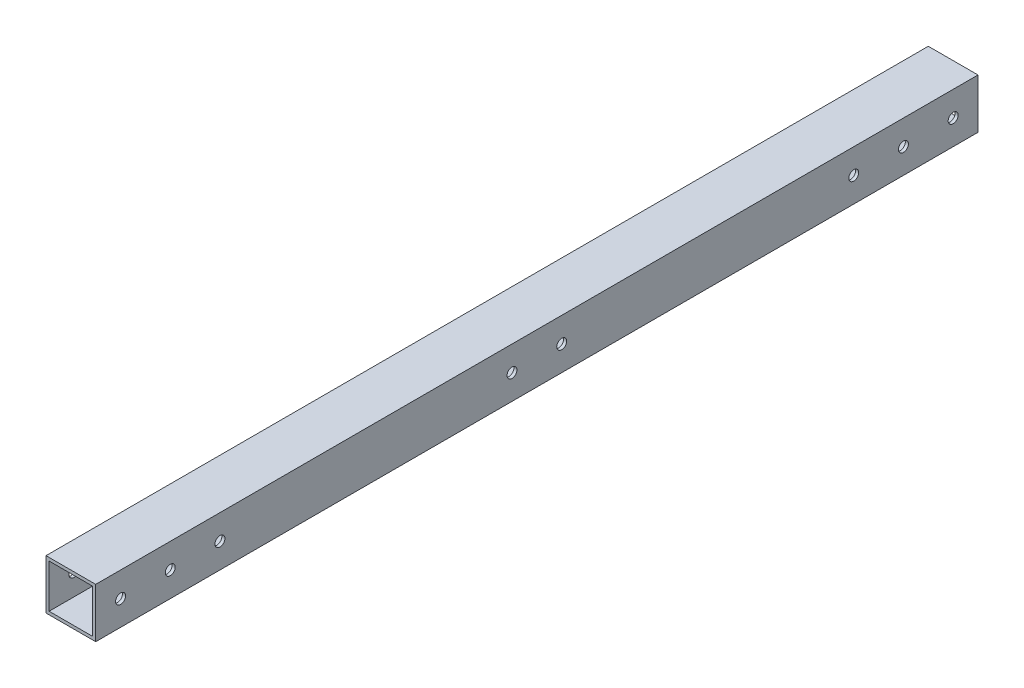
ISO-10303-21;
HEADER;
FILE_DESCRIPTION(('STEP AP214'),'2;1');
FILE_NAME('part.step','',(''),(''),'','','');
FILE_SCHEMA(('AUTOMOTIVE_DESIGN { 1 0 10303 214 1 1 1 1 }'));
ENDSEC;
DATA;
#1=APPLICATION_CONTEXT('core data for automotive mechanical design processes');
#2=APPLICATION_PROTOCOL_DEFINITION('international standard','automotive_design',2000,#1);
#3=PRODUCT_CONTEXT('',#1,'mechanical');
#4=PRODUCT('Part','Part','',(#3));
#5=PRODUCT_RELATED_PRODUCT_CATEGORY('part','',(#4));
#6=PRODUCT_DEFINITION_FORMATION('','',#4);
#7=PRODUCT_DEFINITION_CONTEXT('part definition',#1,'design');
#8=PRODUCT_DEFINITION('design','',#6,#7);
#9=PRODUCT_DEFINITION_SHAPE('','',#8);
#10=(LENGTH_UNIT() NAMED_UNIT(*) SI_UNIT(.MILLI.,.METRE.));
#11=(NAMED_UNIT(*) PLANE_ANGLE_UNIT() SI_UNIT($,.RADIAN.));
#12=(NAMED_UNIT(*) SI_UNIT($,.STERADIAN.) SOLID_ANGLE_UNIT());
#13=UNCERTAINTY_MEASURE_WITH_UNIT(LENGTH_MEASURE(1.E-05),#10,'distance_accuracy_value','');
#14=(GEOMETRIC_REPRESENTATION_CONTEXT(3) GLOBAL_UNCERTAINTY_ASSIGNED_CONTEXT((#13)) GLOBAL_UNIT_ASSIGNED_CONTEXT((#10,
#11,#12)) REPRESENTATION_CONTEXT('',''));
#15=CARTESIAN_POINT('',(0.,0.,0.));
#16=DIRECTION('',(0.,0.,1.));
#17=DIRECTION('',(1.,0.,0.));
#18=AXIS2_PLACEMENT_3D('',#15,#16,#17);
#19=CARTESIAN_POINT('',(0.,0.,450.85));
#20=DIRECTION('',(0.,0.,-1.));
#21=DIRECTION('',(-1.,0.,0.));
#22=AXIS2_PLACEMENT_3D('',#19,#20,#21);
#23=PLANE('',#22);
#24=DIRECTION('',(0.,-1.,0.));
#25=VECTOR('',#24,1.);
#26=CARTESIAN_POINT('',(0.,0.,450.85));
#27=LINE('',#26,#25);
#28=CARTESIAN_POINT('',(0.,25.4,450.85));
#29=VERTEX_POINT('',#28);
#30=CARTESIAN_POINT('',(0.,0.,450.85));
#31=VERTEX_POINT('',#30);
#32=EDGE_CURVE('E157',#29,#31,#27,.T.);
#33=ORIENTED_EDGE('',*,*,#32,.T.);
#34=DIRECTION('',(1.,0.,0.));
#35=VECTOR('',#34,1.);
#36=CARTESIAN_POINT('',(0.,0.,450.85));
#37=LINE('',#36,#35);
#38=CARTESIAN_POINT('',(25.4,0.,450.85));
#39=VERTEX_POINT('',#38);
#40=EDGE_CURVE('E161',#31,#39,#37,.T.);
#41=ORIENTED_EDGE('',*,*,#40,.T.);
#42=DIRECTION('',(0.,1.,0.));
#43=VECTOR('',#42,1.);
#44=CARTESIAN_POINT('',(25.4,0.,450.85));
#45=LINE('',#44,#43);
#46=CARTESIAN_POINT('',(25.4,25.4,450.85));
#47=VERTEX_POINT('',#46);
#48=EDGE_CURVE('E165',#39,#47,#45,.T.);
#49=ORIENTED_EDGE('',*,*,#48,.T.);
#50=DIRECTION('',(-1.,0.,0.));
#51=VECTOR('',#50,1.);
#52=CARTESIAN_POINT('',(0.,25.4,450.85));
#53=LINE('',#52,#51);
#54=EDGE_CURVE('E168',#47,#29,#53,.T.);
#55=ORIENTED_EDGE('',*,*,#54,.T.);
#56=EDGE_LOOP('',(#33,#41,#49,#55));
#57=FACE_BOUND('',#56,.T.);
#58=DIRECTION('',(0.,-1.,0.));
#59=VECTOR('',#58,1.);
#60=CARTESIAN_POINT('',(1.5875,1.5875,450.85));
#61=LINE('',#60,#59);
#62=CARTESIAN_POINT('',(1.5875,23.8125,450.85));
#63=VERTEX_POINT('',#62);
#64=CARTESIAN_POINT('',(1.5875,1.5875,450.85));
#65=VERTEX_POINT('',#64);
#66=EDGE_CURVE('E107',#63,#65,#61,.T.);
#67=ORIENTED_EDGE('',*,*,#66,.F.);
#68=DIRECTION('',(-1.,0.,0.));
#69=VECTOR('',#68,1.);
#70=CARTESIAN_POINT('',(1.5875,23.8125,450.85));
#71=LINE('',#70,#69);
#72=CARTESIAN_POINT('',(23.8125,23.8125,450.85));
#73=VERTEX_POINT('',#72);
#74=EDGE_CURVE('E133',#73,#63,#71,.T.);
#75=ORIENTED_EDGE('',*,*,#74,.F.);
#76=DIRECTION('',(0.,1.,0.));
#77=VECTOR('',#76,1.);
#78=CARTESIAN_POINT('',(23.8125,1.5875,450.85));
#79=LINE('',#78,#77);
#80=CARTESIAN_POINT('',(23.8125,1.5875,450.85));
#81=VERTEX_POINT('',#80);
#82=EDGE_CURVE('E129',#81,#73,#79,.T.);
#83=ORIENTED_EDGE('',*,*,#82,.F.);
#84=DIRECTION('',(1.,0.,0.));
#85=VECTOR('',#84,1.);
#86=CARTESIAN_POINT('',(1.5875,1.5875,450.85));
#87=LINE('',#86,#85);
#88=EDGE_CURVE('E116',#65,#81,#87,.T.);
#89=ORIENTED_EDGE('',*,*,#88,.F.);
#90=EDGE_LOOP('',(#67,#75,#83,#89));
#91=FACE_BOUND('',#90,.T.);
#92=ADVANCED_FACE('F39',(#57,#91),#23,.F.);
#93=CARTESIAN_POINT('',(0.,0.,0.));
#94=DIRECTION('',(0.,0.,-1.));
#95=DIRECTION('',(-1.,0.,0.));
#96=AXIS2_PLACEMENT_3D('',#93,#94,#95);
#97=PLANE('',#96);
#98=DIRECTION('',(0.,-1.,0.));
#99=VECTOR('',#98,1.);
#100=CARTESIAN_POINT('',(0.,0.,0.));
#101=LINE('',#100,#99);
#102=CARTESIAN_POINT('',(0.,25.4,0.));
#103=VERTEX_POINT('',#102);
#104=CARTESIAN_POINT('',(0.,0.,0.));
#105=VERTEX_POINT('',#104);
#106=EDGE_CURVE('E125',#103,#105,#101,.T.);
#107=ORIENTED_EDGE('',*,*,#106,.F.);
#108=DIRECTION('',(-1.,0.,0.));
#109=VECTOR('',#108,1.);
#110=CARTESIAN_POINT('',(0.,25.4,0.));
#111=LINE('',#110,#109);
#112=CARTESIAN_POINT('',(25.4,25.4,0.));
#113=VERTEX_POINT('',#112);
#114=EDGE_CURVE('E162',#113,#103,#111,.T.);
#115=ORIENTED_EDGE('',*,*,#114,.F.);
#116=DIRECTION('',(0.,1.,0.));
#117=VECTOR('',#116,1.);
#118=CARTESIAN_POINT('',(25.4,0.,0.));
#119=LINE('',#118,#117);
#120=CARTESIAN_POINT('',(25.4,0.,0.));
#121=VERTEX_POINT('',#120);
#122=EDGE_CURVE('E178',#121,#113,#119,.T.);
#123=ORIENTED_EDGE('',*,*,#122,.F.);
#124=DIRECTION('',(1.,0.,0.));
#125=VECTOR('',#124,1.);
#126=CARTESIAN_POINT('',(0.,0.,0.));
#127=LINE('',#126,#125);
#128=EDGE_CURVE('E175',#105,#121,#127,.T.);
#129=ORIENTED_EDGE('',*,*,#128,.F.);
#130=EDGE_LOOP('',(#107,#115,#123,#129));
#131=FACE_BOUND('',#130,.T.);
#132=DIRECTION('',(-1.,0.,0.));
#133=VECTOR('',#132,1.);
#134=CARTESIAN_POINT('',(1.5875,23.8125,0.));
#135=LINE('',#134,#133);
#136=CARTESIAN_POINT('',(23.8125,23.8125,0.));
#137=VERTEX_POINT('',#136);
#138=CARTESIAN_POINT('',(1.5875,23.8125,0.));
#139=VERTEX_POINT('',#138);
#140=EDGE_CURVE('E117',#137,#139,#135,.T.);
#141=ORIENTED_EDGE('',*,*,#140,.T.);
#142=DIRECTION('',(0.,-1.,0.));
#143=VECTOR('',#142,1.);
#144=CARTESIAN_POINT('',(1.5875,1.5875,0.));
#145=LINE('',#144,#143);
#146=CARTESIAN_POINT('',(1.5875,1.5875,0.));
#147=VERTEX_POINT('',#146);
#148=EDGE_CURVE('E65',#139,#147,#145,.T.);
#149=ORIENTED_EDGE('',*,*,#148,.T.);
#150=DIRECTION('',(1.,0.,0.));
#151=VECTOR('',#150,1.);
#152=CARTESIAN_POINT('',(1.5875,1.5875,0.));
#153=LINE('',#152,#151);
#154=CARTESIAN_POINT('',(23.8125,1.5875,0.));
#155=VERTEX_POINT('',#154);
#156=EDGE_CURVE('E123',#147,#155,#153,.T.);
#157=ORIENTED_EDGE('',*,*,#156,.T.);
#158=DIRECTION('',(0.,1.,0.));
#159=VECTOR('',#158,1.);
#160=CARTESIAN_POINT('',(23.8125,1.5875,0.));
#161=LINE('',#160,#159);
#162=EDGE_CURVE('E144',#155,#137,#161,.T.);
#163=ORIENTED_EDGE('',*,*,#162,.T.);
#164=EDGE_LOOP('',(#141,#149,#157,#163));
#165=FACE_BOUND('',#164,.T.);
#166=ADVANCED_FACE('F270',(#131,#165),#97,.T.);
#167=CARTESIAN_POINT('',(0.,0.,450.85));
#168=DIRECTION('',(1.,0.,0.));
#169=DIRECTION('',(0.,0.,-1.));
#170=AXIS2_PLACEMENT_3D('',#167,#168,#169);
#171=PLANE('',#170);
#172=CARTESIAN_POINT('',(0.,12.7,438.15));
#173=DIRECTION('',(1.,0.,0.));
#174=DIRECTION('',(0.,0.,-1.));
#175=AXIS2_PLACEMENT_3D('',#172,#173,#174);
#176=CIRCLE('',#175,2.54000000000001);
#177=CARTESIAN_POINT('',(0.,12.7,435.61));
#178=VERTEX_POINT('',#177);
#179=EDGE_CURVE('E198',#178,#178,#176,.T.);
#180=ORIENTED_EDGE('',*,*,#179,.T.);
#181=EDGE_LOOP('',(#180));
#182=FACE_BOUND('',#181,.T.);
#183=CARTESIAN_POINT('',(0.,12.7,12.7));
#184=DIRECTION('',(1.,0.,0.));
#185=DIRECTION('',(0.,0.,1.));
#186=AXIS2_PLACEMENT_3D('',#183,#184,#185);
#187=CIRCLE('',#186,2.54000000000001);
#188=CARTESIAN_POINT('',(0.,12.7,15.24));
#189=VERTEX_POINT('',#188);
#190=EDGE_CURVE('E327',#189,#189,#187,.T.);
#191=ORIENTED_EDGE('',*,*,#190,.T.);
#192=EDGE_LOOP('',(#191));
#193=FACE_BOUND('',#192,.T.);
#194=CARTESIAN_POINT('',(0.,12.7,238.125));
#195=DIRECTION('',(1.,0.,0.));
#196=DIRECTION('',(0.,0.,-1.));
#197=AXIS2_PLACEMENT_3D('',#194,#195,#196);
#198=CIRCLE('',#197,2.53999999999998);
#199=CARTESIAN_POINT('',(0.,12.7,235.585));
#200=VERTEX_POINT('',#199);
#201=EDGE_CURVE('E331',#200,#200,#198,.T.);
#202=ORIENTED_EDGE('',*,*,#201,.T.);
#203=EDGE_LOOP('',(#202));
#204=FACE_BOUND('',#203,.T.);
#205=CARTESIAN_POINT('',(0.,12.7,212.725));
#206=DIRECTION('',(1.,0.,0.));
#207=DIRECTION('',(0.,0.,1.));
#208=AXIS2_PLACEMENT_3D('',#205,#206,#207);
#209=CIRCLE('',#208,2.53999999999998);
#210=CARTESIAN_POINT('',(0.,12.7,215.265));
#211=VERTEX_POINT('',#210);
#212=EDGE_CURVE('E335',#211,#211,#209,.T.);
#213=ORIENTED_EDGE('',*,*,#212,.T.);
#214=EDGE_LOOP('',(#213));
#215=FACE_BOUND('',#214,.T.);
#216=CARTESIAN_POINT('',(0.,12.7,38.1));
#217=DIRECTION('',(1.,0.,0.));
#218=DIRECTION('',(0.,0.,1.));
#219=AXIS2_PLACEMENT_3D('',#216,#217,#218);
#220=CIRCLE('',#219,2.54000000000001);
#221=CARTESIAN_POINT('',(0.,12.7,40.64));
#222=VERTEX_POINT('',#221);
#223=EDGE_CURVE('E339',#222,#222,#220,.T.);
#224=ORIENTED_EDGE('',*,*,#223,.T.);
#225=EDGE_LOOP('',(#224));
#226=FACE_BOUND('',#225,.T.);
#227=CARTESIAN_POINT('',(0.,12.7,63.5));
#228=DIRECTION('',(1.,0.,0.));
#229=DIRECTION('',(0.,0.,1.));
#230=AXIS2_PLACEMENT_3D('',#227,#228,#229);
#231=CIRCLE('',#230,2.54000000000001);
#232=CARTESIAN_POINT('',(0.,12.7,66.04));
#233=VERTEX_POINT('',#232);
#234=EDGE_CURVE('E343',#233,#233,#231,.T.);
#235=ORIENTED_EDGE('',*,*,#234,.T.);
#236=EDGE_LOOP('',(#235));
#237=FACE_BOUND('',#236,.T.);
#238=CARTESIAN_POINT('',(0.,12.7,387.35));
#239=DIRECTION('',(1.,0.,0.));
#240=DIRECTION('',(0.,0.,-1.));
#241=AXIS2_PLACEMENT_3D('',#238,#239,#240);
#242=CIRCLE('',#241,2.54000000000001);
#243=CARTESIAN_POINT('',(0.,12.7,384.81));
#244=VERTEX_POINT('',#243);
#245=EDGE_CURVE('E347',#244,#244,#242,.T.);
#246=ORIENTED_EDGE('',*,*,#245,.T.);
#247=EDGE_LOOP('',(#246));
#248=FACE_BOUND('',#247,.T.);
#249=CARTESIAN_POINT('',(0.,12.7,412.75));
#250=DIRECTION('',(1.,0.,0.));
#251=DIRECTION('',(0.,0.,-1.));
#252=AXIS2_PLACEMENT_3D('',#249,#250,#251);
#253=CIRCLE('',#252,2.54000000000001);
#254=CARTESIAN_POINT('',(0.,12.7,410.21));
#255=VERTEX_POINT('',#254);
#256=EDGE_CURVE('E350',#255,#255,#253,.T.);
#257=ORIENTED_EDGE('',*,*,#256,.T.);
#258=EDGE_LOOP('',(#257));
#259=FACE_BOUND('',#258,.T.);
#260=ORIENTED_EDGE('',*,*,#106,.T.);
#261=DIRECTION('',(0.,0.,-1.));
#262=VECTOR('',#261,1.);
#263=CARTESIAN_POINT('',(0.,0.,450.85));
#264=LINE('',#263,#262);
#265=EDGE_CURVE('E11',#31,#105,#264,.T.);
#266=ORIENTED_EDGE('',*,*,#265,.F.);
#267=ORIENTED_EDGE('',*,*,#32,.F.);
#268=DIRECTION('',(0.,0.,-1.));
#269=VECTOR('',#268,1.);
#270=CARTESIAN_POINT('',(0.,25.4,450.85));
#271=LINE('',#270,#269);
#272=EDGE_CURVE('E171',#29,#103,#271,.T.);
#273=ORIENTED_EDGE('',*,*,#272,.T.);
#274=EDGE_LOOP('',(#260,#266,#267,#273));
#275=FACE_BOUND('',#274,.T.);
#276=ADVANCED_FACE('F41',(#182,#193,#204,#215,#226,#237,#248,#259,#275),#171,.F.);
#277=CARTESIAN_POINT('',(0.,0.,450.85));
#278=DIRECTION('',(0.,1.,0.));
#279=DIRECTION('',(0.,0.,1.));
#280=AXIS2_PLACEMENT_3D('',#277,#278,#279);
#281=PLANE('',#280);
#282=ORIENTED_EDGE('',*,*,#128,.T.);
#283=DIRECTION('',(0.,0.,-1.));
#284=VECTOR('',#283,1.);
#285=CARTESIAN_POINT('',(25.4,0.,450.85));
#286=LINE('',#285,#284);
#287=EDGE_CURVE('E49',#39,#121,#286,.T.);
#288=ORIENTED_EDGE('',*,*,#287,.F.);
#289=ORIENTED_EDGE('',*,*,#40,.F.);
#290=ORIENTED_EDGE('',*,*,#265,.T.);
#291=EDGE_LOOP('',(#282,#288,#289,#290));
#292=FACE_BOUND('',#291,.T.);
#293=ADVANCED_FACE('F299',(#292),#281,.F.);
#294=CARTESIAN_POINT('',(25.4,0.,450.85));
#295=DIRECTION('',(-1.,0.,0.));
#296=DIRECTION('',(0.,0.,1.));
#297=AXIS2_PLACEMENT_3D('',#294,#295,#296);
#298=PLANE('',#297);
#299=CARTESIAN_POINT('',(25.4,12.7,438.15));
#300=DIRECTION('',(1.,0.,0.));
#301=DIRECTION('',(0.,0.,-1.));
#302=AXIS2_PLACEMENT_3D('',#299,#300,#301);
#303=CIRCLE('',#302,2.54000000000001);
#304=CARTESIAN_POINT('',(25.4,12.7,435.61));
#305=VERTEX_POINT('',#304);
#306=EDGE_CURVE('E353',#305,#305,#303,.T.);
#307=ORIENTED_EDGE('',*,*,#306,.F.);
#308=EDGE_LOOP('',(#307));
#309=FACE_BOUND('',#308,.T.);
#310=CARTESIAN_POINT('',(25.4,12.7,12.7));
#311=DIRECTION('',(1.,0.,0.));
#312=DIRECTION('',(0.,0.,1.));
#313=AXIS2_PLACEMENT_3D('',#310,#311,#312);
#314=CIRCLE('',#313,2.54000000000001);
#315=CARTESIAN_POINT('',(25.4,12.7,15.24));
#316=VERTEX_POINT('',#315);
#317=EDGE_CURVE('E574',#316,#316,#314,.T.);
#318=ORIENTED_EDGE('',*,*,#317,.F.);
#319=EDGE_LOOP('',(#318));
#320=FACE_BOUND('',#319,.T.);
#321=CARTESIAN_POINT('',(25.4,12.7,238.125));
#322=DIRECTION('',(1.,0.,0.));
#323=DIRECTION('',(0.,0.,-1.));
#324=AXIS2_PLACEMENT_3D('',#321,#322,#323);
#325=CIRCLE('',#324,2.53999999999998);
#326=CARTESIAN_POINT('',(25.4,12.7,235.585));
#327=VERTEX_POINT('',#326);
#328=EDGE_CURVE('E363',#327,#327,#325,.T.);
#329=ORIENTED_EDGE('',*,*,#328,.F.);
#330=EDGE_LOOP('',(#329));
#331=FACE_BOUND('',#330,.T.);
#332=CARTESIAN_POINT('',(25.4,12.7,212.725));
#333=DIRECTION('',(1.,0.,0.));
#334=DIRECTION('',(0.,0.,1.));
#335=AXIS2_PLACEMENT_3D('',#332,#333,#334);
#336=CIRCLE('',#335,2.53999999999998);
#337=CARTESIAN_POINT('',(25.4,12.7,215.265));
#338=VERTEX_POINT('',#337);
#339=EDGE_CURVE('E583',#338,#338,#336,.T.);
#340=ORIENTED_EDGE('',*,*,#339,.F.);
#341=EDGE_LOOP('',(#340));
#342=FACE_BOUND('',#341,.T.);
#343=CARTESIAN_POINT('',(25.4,12.7,38.1));
#344=DIRECTION('',(1.,0.,0.));
#345=DIRECTION('',(0.,0.,1.));
#346=AXIS2_PLACEMENT_3D('',#343,#344,#345);
#347=CIRCLE('',#346,2.54000000000001);
#348=CARTESIAN_POINT('',(25.4,12.7,40.64));
#349=VERTEX_POINT('',#348);
#350=EDGE_CURVE('E380',#349,#349,#347,.T.);
#351=ORIENTED_EDGE('',*,*,#350,.F.);
#352=EDGE_LOOP('',(#351));
#353=FACE_BOUND('',#352,.T.);
#354=CARTESIAN_POINT('',(25.4,12.7,63.5));
#355=DIRECTION('',(1.,0.,0.));
#356=DIRECTION('',(0.,0.,1.));
#357=AXIS2_PLACEMENT_3D('',#354,#355,#356);
#358=CIRCLE('',#357,2.54000000000001);
#359=CARTESIAN_POINT('',(25.4,12.7,66.04));
#360=VERTEX_POINT('',#359);
#361=EDGE_CURVE('E374',#360,#360,#358,.T.);
#362=ORIENTED_EDGE('',*,*,#361,.F.);
#363=EDGE_LOOP('',(#362));
#364=FACE_BOUND('',#363,.T.);
#365=CARTESIAN_POINT('',(25.4,12.7,387.35));
#366=DIRECTION('',(1.,0.,0.));
#367=DIRECTION('',(0.,0.,-1.));
#368=AXIS2_PLACEMENT_3D('',#365,#366,#367);
#369=CIRCLE('',#368,2.54000000000001);
#370=CARTESIAN_POINT('',(25.4,12.7,384.81));
#371=VERTEX_POINT('',#370);
#372=EDGE_CURVE('E368',#371,#371,#369,.T.);
#373=ORIENTED_EDGE('',*,*,#372,.F.);
#374=EDGE_LOOP('',(#373));
#375=FACE_BOUND('',#374,.T.);
#376=CARTESIAN_POINT('',(25.4,12.7,412.75));
#377=DIRECTION('',(1.,0.,0.));
#378=DIRECTION('',(0.,0.,-1.));
#379=AXIS2_PLACEMENT_3D('',#376,#377,#378);
#380=CIRCLE('',#379,2.54000000000001);
#381=CARTESIAN_POINT('',(25.4,12.7,410.21));
#382=VERTEX_POINT('',#381);
#383=EDGE_CURVE('E354',#382,#382,#380,.T.);
#384=ORIENTED_EDGE('',*,*,#383,.F.);
#385=EDGE_LOOP('',(#384));
#386=FACE_BOUND('',#385,.T.);
#387=ORIENTED_EDGE('',*,*,#122,.T.);
#388=DIRECTION('',(0.,0.,-1.));
#389=VECTOR('',#388,1.);
#390=CARTESIAN_POINT('',(25.4,25.4,450.85));
#391=LINE('',#390,#389);
#392=EDGE_CURVE('E186',#47,#113,#391,.T.);
#393=ORIENTED_EDGE('',*,*,#392,.F.);
#394=ORIENTED_EDGE('',*,*,#48,.F.);
#395=ORIENTED_EDGE('',*,*,#287,.T.);
#396=EDGE_LOOP('',(#387,#393,#394,#395));
#397=FACE_BOUND('',#396,.T.);
#398=ADVANCED_FACE('F296',(#309,#320,#331,#342,#353,#364,#375,#386,#397),#298,.F.);
#399=CARTESIAN_POINT('',(0.,25.4,450.85));
#400=DIRECTION('',(0.,-1.,0.));
#401=DIRECTION('',(0.,0.,-1.));
#402=AXIS2_PLACEMENT_3D('',#399,#400,#401);
#403=PLANE('',#402);
#404=ORIENTED_EDGE('',*,*,#114,.T.);
#405=ORIENTED_EDGE('',*,*,#272,.F.);
#406=ORIENTED_EDGE('',*,*,#54,.F.);
#407=ORIENTED_EDGE('',*,*,#392,.T.);
#408=EDGE_LOOP('',(#404,#405,#406,#407));
#409=FACE_BOUND('',#408,.T.);
#410=ADVANCED_FACE('F293',(#409),#403,.F.);
#411=CARTESIAN_POINT('',(1.5875,1.5875,450.85));
#412=DIRECTION('',(1.,0.,0.));
#413=DIRECTION('',(0.,0.,-1.));
#414=AXIS2_PLACEMENT_3D('',#411,#412,#413);
#415=PLANE('',#414);
#416=CARTESIAN_POINT('',(1.5875,12.7,438.15));
#417=DIRECTION('',(1.,0.,0.));
#418=DIRECTION('',(0.,0.,-1.));
#419=AXIS2_PLACEMENT_3D('',#416,#417,#418);
#420=CIRCLE('',#419,2.54000000000001);
#421=CARTESIAN_POINT('',(1.5875,12.7,435.61));
#422=VERTEX_POINT('',#421);
#423=EDGE_CURVE('E141',#422,#422,#420,.T.);
#424=ORIENTED_EDGE('',*,*,#423,.F.);
#425=EDGE_LOOP('',(#424));
#426=FACE_BOUND('',#425,.T.);
#427=CARTESIAN_POINT('',(1.5875,12.7,12.7));
#428=DIRECTION('',(1.,0.,0.));
#429=DIRECTION('',(0.,0.,-1.));
#430=AXIS2_PLACEMENT_3D('',#427,#428,#429);
#431=CIRCLE('',#430,2.54000000000001);
#432=CARTESIAN_POINT('',(1.5875,12.7,10.16));
#433=VERTEX_POINT('',#432);
#434=EDGE_CURVE('E226',#433,#433,#431,.T.);
#435=ORIENTED_EDGE('',*,*,#434,.F.);
#436=EDGE_LOOP('',(#435));
#437=FACE_BOUND('',#436,.T.);
#438=CARTESIAN_POINT('',(1.5875,12.7,238.125));
#439=DIRECTION('',(1.,0.,0.));
#440=DIRECTION('',(0.,0.,-1.));
#441=AXIS2_PLACEMENT_3D('',#438,#439,#440);
#442=CIRCLE('',#441,2.53999999999998);
#443=CARTESIAN_POINT('',(1.5875,12.7,235.585));
#444=VERTEX_POINT('',#443);
#445=EDGE_CURVE('E222',#444,#444,#442,.T.);
#446=ORIENTED_EDGE('',*,*,#445,.F.);
#447=EDGE_LOOP('',(#446));
#448=FACE_BOUND('',#447,.T.);
#449=CARTESIAN_POINT('',(1.5875,12.7,212.725));
#450=DIRECTION('',(1.,0.,0.));
#451=DIRECTION('',(0.,0.,-1.));
#452=AXIS2_PLACEMENT_3D('',#449,#450,#451);
#453=CIRCLE('',#452,2.53999999999998);
#454=CARTESIAN_POINT('',(1.5875,12.7,210.185));
#455=VERTEX_POINT('',#454);
#456=EDGE_CURVE('E218',#455,#455,#453,.T.);
#457=ORIENTED_EDGE('',*,*,#456,.F.);
#458=EDGE_LOOP('',(#457));
#459=FACE_BOUND('',#458,.T.);
#460=CARTESIAN_POINT('',(1.5875,12.7,38.1));
#461=DIRECTION('',(1.,0.,0.));
#462=DIRECTION('',(0.,0.,-1.));
#463=AXIS2_PLACEMENT_3D('',#460,#461,#462);
#464=CIRCLE('',#463,2.54000000000001);
#465=CARTESIAN_POINT('',(1.5875,12.7,35.56));
#466=VERTEX_POINT('',#465);
#467=EDGE_CURVE('E213',#466,#466,#464,.T.);
#468=ORIENTED_EDGE('',*,*,#467,.F.);
#469=EDGE_LOOP('',(#468));
#470=FACE_BOUND('',#469,.T.);
#471=CARTESIAN_POINT('',(1.5875,12.7,63.5));
#472=DIRECTION('',(1.,0.,0.));
#473=DIRECTION('',(0.,0.,-1.));
#474=AXIS2_PLACEMENT_3D('',#471,#472,#473);
#475=CIRCLE('',#474,2.54000000000001);
#476=CARTESIAN_POINT('',(1.5875,12.7,60.96));
#477=VERTEX_POINT('',#476);
#478=EDGE_CURVE('E208',#477,#477,#475,.T.);
#479=ORIENTED_EDGE('',*,*,#478,.F.);
#480=EDGE_LOOP('',(#479));
#481=FACE_BOUND('',#480,.T.);
#482=CARTESIAN_POINT('',(1.5875,12.7,387.35));
#483=DIRECTION('',(1.,0.,0.));
#484=DIRECTION('',(0.,0.,-1.));
#485=AXIS2_PLACEMENT_3D('',#482,#483,#484);
#486=CIRCLE('',#485,2.54000000000001);
#487=CARTESIAN_POINT('',(1.5875,12.7,384.81));
#488=VERTEX_POINT('',#487);
#489=EDGE_CURVE('E203',#488,#488,#486,.T.);
#490=ORIENTED_EDGE('',*,*,#489,.F.);
#491=EDGE_LOOP('',(#490));
#492=FACE_BOUND('',#491,.T.);
#493=CARTESIAN_POINT('',(1.5875,12.7,412.75));
#494=DIRECTION('',(1.,0.,0.));
#495=DIRECTION('',(0.,0.,-1.));
#496=AXIS2_PLACEMENT_3D('',#493,#494,#495);
#497=CIRCLE('',#496,2.54000000000001);
#498=CARTESIAN_POINT('',(1.5875,12.7,410.21));
#499=VERTEX_POINT('',#498);
#500=EDGE_CURVE('E197',#499,#499,#497,.T.);
#501=ORIENTED_EDGE('',*,*,#500,.F.);
#502=EDGE_LOOP('',(#501));
#503=FACE_BOUND('',#502,.T.);
#504=ORIENTED_EDGE('',*,*,#148,.F.);
#505=DIRECTION('',(0.,0.,-1.));
#506=VECTOR('',#505,1.);
#507=CARTESIAN_POINT('',(1.5875,23.8125,450.85));
#508=LINE('',#507,#506);
#509=EDGE_CURVE('E111',#63,#139,#508,.T.);
#510=ORIENTED_EDGE('',*,*,#509,.F.);
#511=ORIENTED_EDGE('',*,*,#66,.T.);
#512=DIRECTION('',(0.,0.,-1.));
#513=VECTOR('',#512,1.);
#514=CARTESIAN_POINT('',(1.5875,1.5875,450.85));
#515=LINE('',#514,#513);
#516=EDGE_CURVE('E110',#65,#147,#515,.T.);
#517=ORIENTED_EDGE('',*,*,#516,.T.);
#518=EDGE_LOOP('',(#504,#510,#511,#517));
#519=FACE_BOUND('',#518,.T.);
#520=ADVANCED_FACE('F109',(#426,#437,#448,#459,#470,#481,#492,#503,#519),#415,.T.);
#521=CARTESIAN_POINT('',(1.5875,1.5875,450.85));
#522=DIRECTION('',(0.,1.,0.));
#523=DIRECTION('',(0.,0.,1.));
#524=AXIS2_PLACEMENT_3D('',#521,#522,#523);
#525=PLANE('',#524);
#526=ORIENTED_EDGE('',*,*,#156,.F.);
#527=ORIENTED_EDGE('',*,*,#516,.F.);
#528=ORIENTED_EDGE('',*,*,#88,.T.);
#529=DIRECTION('',(0.,0.,-1.));
#530=VECTOR('',#529,1.);
#531=CARTESIAN_POINT('',(23.8125,1.5875,450.85));
#532=LINE('',#531,#530);
#533=EDGE_CURVE('E126',#81,#155,#532,.T.);
#534=ORIENTED_EDGE('',*,*,#533,.T.);
#535=EDGE_LOOP('',(#526,#527,#528,#534));
#536=FACE_BOUND('',#535,.T.);
#537=ADVANCED_FACE('F120',(#536),#525,.T.);
#538=CARTESIAN_POINT('',(23.8125,1.5875,450.85));
#539=DIRECTION('',(-1.,0.,0.));
#540=DIRECTION('',(0.,0.,1.));
#541=AXIS2_PLACEMENT_3D('',#538,#539,#540);
#542=PLANE('',#541);
#543=CARTESIAN_POINT('',(23.8125,12.7,438.15));
#544=DIRECTION('',(-1.,0.,0.));
#545=DIRECTION('',(0.,0.,1.));
#546=AXIS2_PLACEMENT_3D('',#543,#544,#545);
#547=CIRCLE('',#546,2.54000000000001);
#548=CARTESIAN_POINT('',(23.8125,12.7,440.69));
#549=VERTEX_POINT('',#548);
#550=EDGE_CURVE('E43',#549,#549,#547,.T.);
#551=ORIENTED_EDGE('',*,*,#550,.F.);
#552=EDGE_LOOP('',(#551));
#553=FACE_BOUND('',#552,.T.);
#554=CARTESIAN_POINT('',(23.8125,12.7,12.7));
#555=DIRECTION('',(-1.,0.,0.));
#556=DIRECTION('',(0.,0.,1.));
#557=AXIS2_PLACEMENT_3D('',#554,#555,#556);
#558=CIRCLE('',#557,2.54000000000001);
#559=CARTESIAN_POINT('',(23.8125,12.7,15.24));
#560=VERTEX_POINT('',#559);
#561=EDGE_CURVE('E223',#560,#560,#558,.T.);
#562=ORIENTED_EDGE('',*,*,#561,.F.);
#563=EDGE_LOOP('',(#562));
#564=FACE_BOUND('',#563,.T.);
#565=CARTESIAN_POINT('',(23.8125,12.7,238.125));
#566=DIRECTION('',(-1.,0.,0.));
#567=DIRECTION('',(0.,0.,1.));
#568=AXIS2_PLACEMENT_3D('',#565,#566,#567);
#569=CIRCLE('',#568,2.53999999999998);
#570=CARTESIAN_POINT('',(23.8125,12.7,240.665));
#571=VERTEX_POINT('',#570);
#572=EDGE_CURVE('E219',#571,#571,#569,.T.);
#573=ORIENTED_EDGE('',*,*,#572,.F.);
#574=EDGE_LOOP('',(#573));
#575=FACE_BOUND('',#574,.T.);
#576=CARTESIAN_POINT('',(23.8125,12.7,212.725));
#577=DIRECTION('',(-1.,0.,0.));
#578=DIRECTION('',(0.,0.,1.));
#579=AXIS2_PLACEMENT_3D('',#576,#577,#578);
#580=CIRCLE('',#579,2.53999999999998);
#581=CARTESIAN_POINT('',(23.8125,12.7,215.265));
#582=VERTEX_POINT('',#581);
#583=EDGE_CURVE('E214',#582,#582,#580,.T.);
#584=ORIENTED_EDGE('',*,*,#583,.F.);
#585=EDGE_LOOP('',(#584));
#586=FACE_BOUND('',#585,.T.);
#587=CARTESIAN_POINT('',(23.8125,12.7,38.1));
#588=DIRECTION('',(-1.,0.,0.));
#589=DIRECTION('',(0.,0.,1.));
#590=AXIS2_PLACEMENT_3D('',#587,#588,#589);
#591=CIRCLE('',#590,2.54000000000001);
#592=CARTESIAN_POINT('',(23.8125,12.7,40.64));
#593=VERTEX_POINT('',#592);
#594=EDGE_CURVE('E209',#593,#593,#591,.T.);
#595=ORIENTED_EDGE('',*,*,#594,.F.);
#596=EDGE_LOOP('',(#595));
#597=FACE_BOUND('',#596,.T.);
#598=CARTESIAN_POINT('',(23.8125,12.7,63.5));
#599=DIRECTION('',(-1.,0.,0.));
#600=DIRECTION('',(0.,0.,1.));
#601=AXIS2_PLACEMENT_3D('',#598,#599,#600);
#602=CIRCLE('',#601,2.54000000000001);
#603=CARTESIAN_POINT('',(23.8125,12.7,66.04));
#604=VERTEX_POINT('',#603);
#605=EDGE_CURVE('E204',#604,#604,#602,.T.);
#606=ORIENTED_EDGE('',*,*,#605,.F.);
#607=EDGE_LOOP('',(#606));
#608=FACE_BOUND('',#607,.T.);
#609=CARTESIAN_POINT('',(23.8125,12.7,387.35));
#610=DIRECTION('',(-1.,0.,0.));
#611=DIRECTION('',(0.,0.,1.));
#612=AXIS2_PLACEMENT_3D('',#609,#610,#611);
#613=CIRCLE('',#612,2.54000000000001);
#614=CARTESIAN_POINT('',(23.8125,12.7,389.89));
#615=VERTEX_POINT('',#614);
#616=EDGE_CURVE('E199',#615,#615,#613,.T.);
#617=ORIENTED_EDGE('',*,*,#616,.F.);
#618=EDGE_LOOP('',(#617));
#619=FACE_BOUND('',#618,.T.);
#620=CARTESIAN_POINT('',(23.8125,12.7,412.75));
#621=DIRECTION('',(-1.,0.,0.));
#622=DIRECTION('',(0.,0.,1.));
#623=AXIS2_PLACEMENT_3D('',#620,#621,#622);
#624=CIRCLE('',#623,2.54000000000001);
#625=CARTESIAN_POINT('',(23.8125,12.7,415.29));
#626=VERTEX_POINT('',#625);
#627=EDGE_CURVE('E193',#626,#626,#624,.T.);
#628=ORIENTED_EDGE('',*,*,#627,.F.);
#629=EDGE_LOOP('',(#628));
#630=FACE_BOUND('',#629,.T.);
#631=ORIENTED_EDGE('',*,*,#162,.F.);
#632=ORIENTED_EDGE('',*,*,#533,.F.);
#633=ORIENTED_EDGE('',*,*,#82,.T.);
#634=DIRECTION('',(0.,0.,-1.));
#635=VECTOR('',#634,1.);
#636=CARTESIAN_POINT('',(23.8125,23.8125,450.85));
#637=LINE('',#636,#635);
#638=EDGE_CURVE('E57',#73,#137,#637,.T.);
#639=ORIENTED_EDGE('',*,*,#638,.T.);
#640=EDGE_LOOP('',(#631,#632,#633,#639));
#641=FACE_BOUND('',#640,.T.);
#642=ADVANCED_FACE('F250',(#553,#564,#575,#586,#597,#608,#619,#630,#641),#542,.T.);
#643=CARTESIAN_POINT('',(1.5875,23.8125,450.85));
#644=DIRECTION('',(0.,-1.,0.));
#645=DIRECTION('',(0.,0.,-1.));
#646=AXIS2_PLACEMENT_3D('',#643,#644,#645);
#647=PLANE('',#646);
#648=ORIENTED_EDGE('',*,*,#140,.F.);
#649=ORIENTED_EDGE('',*,*,#638,.F.);
#650=ORIENTED_EDGE('',*,*,#74,.T.);
#651=ORIENTED_EDGE('',*,*,#509,.T.);
#652=EDGE_LOOP('',(#648,#649,#650,#651));
#653=FACE_BOUND('',#652,.T.);
#654=ADVANCED_FACE('F253',(#653),#647,.T.);
#655=CARTESIAN_POINT('',(0.,12.7,412.75));
#656=DIRECTION('',(1.,0.,0.));
#657=DIRECTION('',(0.,0.,-1.));
#658=AXIS2_PLACEMENT_3D('',#655,#656,#657);
#659=CYLINDRICAL_SURFACE('',#658,2.54000000000001);
#660=ORIENTED_EDGE('',*,*,#627,.T.);
#661=EDGE_LOOP('',(#660));
#662=FACE_BOUND('',#661,.T.);
#663=ORIENTED_EDGE('',*,*,#383,.T.);
#664=EDGE_LOOP('',(#663));
#665=FACE_BOUND('',#664,.T.);
#666=ADVANCED_FACE('F272',(#662,#665),#659,.F.);
#667=CARTESIAN_POINT('',(0.,12.7,387.35));
#668=DIRECTION('',(1.,0.,0.));
#669=DIRECTION('',(0.,0.,-1.));
#670=AXIS2_PLACEMENT_3D('',#667,#668,#669);
#671=CYLINDRICAL_SURFACE('',#670,2.54000000000001);
#672=ORIENTED_EDGE('',*,*,#616,.T.);
#673=EDGE_LOOP('',(#672));
#674=FACE_BOUND('',#673,.T.);
#675=ORIENTED_EDGE('',*,*,#372,.T.);
#676=EDGE_LOOP('',(#675));
#677=FACE_BOUND('',#676,.T.);
#678=ADVANCED_FACE('F277',(#674,#677),#671,.F.);
#679=CARTESIAN_POINT('',(0.,12.7,63.5));
#680=DIRECTION('',(1.,0.,0.));
#681=DIRECTION('',(0.,0.,-1.));
#682=AXIS2_PLACEMENT_3D('',#679,#680,#681);
#683=CYLINDRICAL_SURFACE('',#682,2.54000000000001);
#684=ORIENTED_EDGE('',*,*,#605,.T.);
#685=EDGE_LOOP('',(#684));
#686=FACE_BOUND('',#685,.T.);
#687=ORIENTED_EDGE('',*,*,#361,.T.);
#688=EDGE_LOOP('',(#687));
#689=FACE_BOUND('',#688,.T.);
#690=ADVANCED_FACE('F425',(#686,#689),#683,.F.);
#691=CARTESIAN_POINT('',(0.,12.7,38.1));
#692=DIRECTION('',(1.,0.,0.));
#693=DIRECTION('',(0.,0.,-1.));
#694=AXIS2_PLACEMENT_3D('',#691,#692,#693);
#695=CYLINDRICAL_SURFACE('',#694,2.54000000000001);
#696=ORIENTED_EDGE('',*,*,#594,.T.);
#697=EDGE_LOOP('',(#696));
#698=FACE_BOUND('',#697,.T.);
#699=ORIENTED_EDGE('',*,*,#350,.T.);
#700=EDGE_LOOP('',(#699));
#701=FACE_BOUND('',#700,.T.);
#702=ADVANCED_FACE('F428',(#698,#701),#695,.F.);
#703=CARTESIAN_POINT('',(0.,12.7,212.725));
#704=DIRECTION('',(1.,0.,0.));
#705=DIRECTION('',(0.,0.,-1.));
#706=AXIS2_PLACEMENT_3D('',#703,#704,#705);
#707=CYLINDRICAL_SURFACE('',#706,2.53999999999998);
#708=ORIENTED_EDGE('',*,*,#583,.T.);
#709=EDGE_LOOP('',(#708));
#710=FACE_BOUND('',#709,.T.);
#711=ORIENTED_EDGE('',*,*,#339,.T.);
#712=EDGE_LOOP('',(#711));
#713=FACE_BOUND('',#712,.T.);
#714=ADVANCED_FACE('F431',(#710,#713),#707,.F.);
#715=CARTESIAN_POINT('',(0.,12.7,238.125));
#716=DIRECTION('',(1.,0.,0.));
#717=DIRECTION('',(0.,0.,-1.));
#718=AXIS2_PLACEMENT_3D('',#715,#716,#717);
#719=CYLINDRICAL_SURFACE('',#718,2.53999999999998);
#720=ORIENTED_EDGE('',*,*,#572,.T.);
#721=EDGE_LOOP('',(#720));
#722=FACE_BOUND('',#721,.T.);
#723=ORIENTED_EDGE('',*,*,#328,.T.);
#724=EDGE_LOOP('',(#723));
#725=FACE_BOUND('',#724,.T.);
#726=ADVANCED_FACE('F421',(#722,#725),#719,.F.);
#727=CARTESIAN_POINT('',(0.,12.7,12.7));
#728=DIRECTION('',(1.,0.,0.));
#729=DIRECTION('',(0.,0.,-1.));
#730=AXIS2_PLACEMENT_3D('',#727,#728,#729);
#731=CYLINDRICAL_SURFACE('',#730,2.54000000000001);
#732=ORIENTED_EDGE('',*,*,#561,.T.);
#733=EDGE_LOOP('',(#732));
#734=FACE_BOUND('',#733,.T.);
#735=ORIENTED_EDGE('',*,*,#317,.T.);
#736=EDGE_LOOP('',(#735));
#737=FACE_BOUND('',#736,.T.);
#738=ADVANCED_FACE('F417',(#734,#737),#731,.F.);
#739=CARTESIAN_POINT('',(0.,12.7,438.15));
#740=DIRECTION('',(1.,0.,0.));
#741=DIRECTION('',(0.,0.,-1.));
#742=AXIS2_PLACEMENT_3D('',#739,#740,#741);
#743=CYLINDRICAL_SURFACE('',#742,2.54000000000001);
#744=ORIENTED_EDGE('',*,*,#550,.T.);
#745=EDGE_LOOP('',(#744));
#746=FACE_BOUND('',#745,.T.);
#747=ORIENTED_EDGE('',*,*,#306,.T.);
#748=EDGE_LOOP('',(#747));
#749=FACE_BOUND('',#748,.T.);
#750=ADVANCED_FACE('F247',(#746,#749),#743,.F.);
#751=ORIENTED_EDGE('',*,*,#500,.T.);
#752=EDGE_LOOP('',(#751));
#753=FACE_BOUND('',#752,.T.);
#754=ORIENTED_EDGE('',*,*,#256,.F.);
#755=EDGE_LOOP('',(#754));
#756=FACE_BOUND('',#755,.T.);
#757=ADVANCED_FACE('F280',(#753,#756),#659,.F.);
#758=ORIENTED_EDGE('',*,*,#489,.T.);
#759=EDGE_LOOP('',(#758));
#760=FACE_BOUND('',#759,.T.);
#761=ORIENTED_EDGE('',*,*,#245,.F.);
#762=EDGE_LOOP('',(#761));
#763=FACE_BOUND('',#762,.T.);
#764=ADVANCED_FACE('F409',(#760,#763),#671,.F.);
#765=ORIENTED_EDGE('',*,*,#478,.T.);
#766=EDGE_LOOP('',(#765));
#767=FACE_BOUND('',#766,.T.);
#768=ORIENTED_EDGE('',*,*,#234,.F.);
#769=EDGE_LOOP('',(#768));
#770=FACE_BOUND('',#769,.T.);
#771=ADVANCED_FACE('F414',(#767,#770),#683,.F.);
#772=ORIENTED_EDGE('',*,*,#467,.T.);
#773=EDGE_LOOP('',(#772));
#774=FACE_BOUND('',#773,.T.);
#775=ORIENTED_EDGE('',*,*,#223,.F.);
#776=EDGE_LOOP('',(#775));
#777=FACE_BOUND('',#776,.T.);
#778=ADVANCED_FACE('F396',(#774,#777),#695,.F.);
#779=ORIENTED_EDGE('',*,*,#456,.T.);
#780=EDGE_LOOP('',(#779));
#781=FACE_BOUND('',#780,.T.);
#782=ORIENTED_EDGE('',*,*,#212,.F.);
#783=EDGE_LOOP('',(#782));
#784=FACE_BOUND('',#783,.T.);
#785=ADVANCED_FACE('F438',(#781,#784),#707,.F.);
#786=ORIENTED_EDGE('',*,*,#445,.T.);
#787=EDGE_LOOP('',(#786));
#788=FACE_BOUND('',#787,.T.);
#789=ORIENTED_EDGE('',*,*,#201,.F.);
#790=EDGE_LOOP('',(#789));
#791=FACE_BOUND('',#790,.T.);
#792=ADVANCED_FACE('F445',(#788,#791),#719,.F.);
#793=ORIENTED_EDGE('',*,*,#434,.T.);
#794=EDGE_LOOP('',(#793));
#795=FACE_BOUND('',#794,.T.);
#796=ORIENTED_EDGE('',*,*,#190,.F.);
#797=EDGE_LOOP('',(#796));
#798=FACE_BOUND('',#797,.T.);
#799=ADVANCED_FACE('F474',(#795,#798),#731,.F.);
#800=ORIENTED_EDGE('',*,*,#423,.T.);
#801=EDGE_LOOP('',(#800));
#802=FACE_BOUND('',#801,.T.);
#803=ORIENTED_EDGE('',*,*,#179,.F.);
#804=EDGE_LOOP('',(#803));
#805=FACE_BOUND('',#804,.T.);
#806=ADVANCED_FACE('F419',(#802,#805),#743,.F.);
#807=CLOSED_SHELL('',(#92,#166,#276,#293,#398,#410,#520,#537,#642,#654,#666,#678,#690,#702,#714,
#726,#738,#750,#757,#764,#771,#778,#785,#792,#799,#806));
#808=MANIFOLD_SOLID_BREP('B2',#807);
#809=ADVANCED_BREP_SHAPE_REPRESENTATION('',(#18,#808),#14);
#810=SHAPE_DEFINITION_REPRESENTATION(#9,#809);
ENDSEC;
END-ISO-10303-21;
